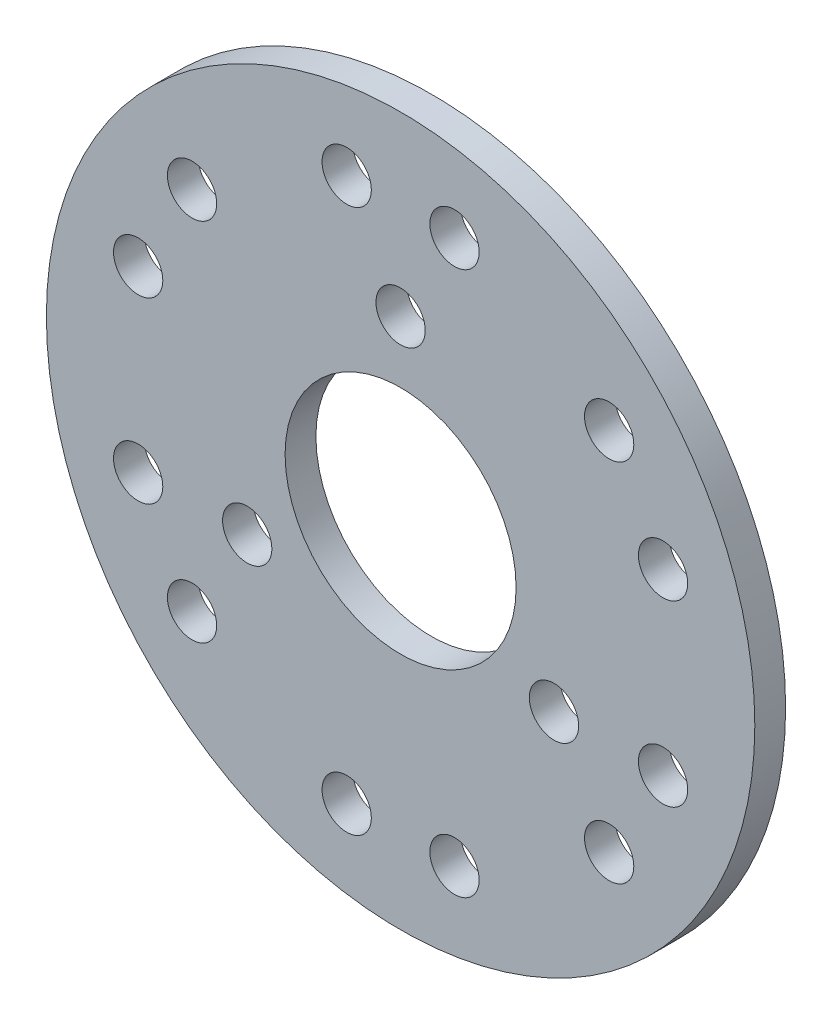
ISO-10303-21;
HEADER;
FILE_DESCRIPTION(('STEP AP214'),'2;1');
FILE_NAME('part.step','',(''),(''),'','','');
FILE_SCHEMA(('AUTOMOTIVE_DESIGN { 1 0 10303 214 1 1 1 1 }'));
ENDSEC;
DATA;
#1=APPLICATION_CONTEXT('core data for automotive mechanical design processes');
#2=APPLICATION_PROTOCOL_DEFINITION('international standard','automotive_design',2000,#1);
#3=PRODUCT_CONTEXT('',#1,'mechanical');
#4=PRODUCT('Part','Part','',(#3));
#5=PRODUCT_RELATED_PRODUCT_CATEGORY('part','',(#4));
#6=PRODUCT_DEFINITION_FORMATION('','',#4);
#7=PRODUCT_DEFINITION_CONTEXT('part definition',#1,'design');
#8=PRODUCT_DEFINITION('design','',#6,#7);
#9=PRODUCT_DEFINITION_SHAPE('','',#8);
#10=(LENGTH_UNIT() NAMED_UNIT(*) SI_UNIT(.MILLI.,.METRE.));
#11=(NAMED_UNIT(*) PLANE_ANGLE_UNIT() SI_UNIT($,.RADIAN.));
#12=(NAMED_UNIT(*) SI_UNIT($,.STERADIAN.) SOLID_ANGLE_UNIT());
#13=UNCERTAINTY_MEASURE_WITH_UNIT(LENGTH_MEASURE(1.E-05),#10,'distance_accuracy_value','');
#14=(GEOMETRIC_REPRESENTATION_CONTEXT(3) GLOBAL_UNCERTAINTY_ASSIGNED_CONTEXT((#13)) GLOBAL_UNIT_ASSIGNED_CONTEXT((#10,
#11,#12)) REPRESENTATION_CONTEXT('',''));
#15=CARTESIAN_POINT('',(0.,0.,0.));
#16=DIRECTION('',(0.,0.,1.));
#17=DIRECTION('',(1.,0.,0.));
#18=AXIS2_PLACEMENT_3D('',#15,#16,#17);
#19=CARTESIAN_POINT('',(0.,0.,2.));
#20=DIRECTION('',(0.,0.,-1.));
#21=DIRECTION('',(-1.,0.,0.));
#22=AXIS2_PLACEMENT_3D('',#19,#20,#21);
#23=CYLINDRICAL_SURFACE('',#22,23.);
#24=CARTESIAN_POINT('',(0.,0.,2.));
#25=DIRECTION('',(0.,0.,1.));
#26=DIRECTION('',(1.,0.,0.));
#27=AXIS2_PLACEMENT_3D('',#24,#25,#26);
#28=CIRCLE('',#27,23.);
#29=CARTESIAN_POINT('',(23.,0.,2.));
#30=VERTEX_POINT('',#29);
#31=EDGE_CURVE('E10',#30,#30,#28,.T.);
#32=ORIENTED_EDGE('',*,*,#31,.F.);
#33=EDGE_LOOP('',(#32));
#34=FACE_BOUND('',#33,.T.);
#35=CARTESIAN_POINT('',(0.,0.,0.));
#36=DIRECTION('',(0.,0.,1.));
#37=DIRECTION('',(1.,0.,0.));
#38=AXIS2_PLACEMENT_3D('',#35,#36,#37);
#39=CIRCLE('',#38,23.);
#40=CARTESIAN_POINT('',(23.,0.,0.));
#41=VERTEX_POINT('',#40);
#42=EDGE_CURVE('E34',#41,#41,#39,.T.);
#43=ORIENTED_EDGE('',*,*,#42,.T.);
#44=EDGE_LOOP('',(#43));
#45=FACE_BOUND('',#44,.T.);
#46=ADVANCED_FACE('F31',(#34,#45),#23,.T.);
#47=CARTESIAN_POINT('',(0.,0.,2.));
#48=DIRECTION('',(0.,0.,1.));
#49=DIRECTION('',(1.,0.,0.));
#50=AXIS2_PLACEMENT_3D('',#47,#48,#49);
#51=PLANE('',#50);
#52=CARTESIAN_POINT('',(-3.50000000000012,-17.6564435830096,2.));
#53=DIRECTION('',(0.,0.,1.));
#54=DIRECTION('',(1.,0.,0.));
#55=AXIS2_PLACEMENT_3D('',#52,#53,#54);
#56=CIRCLE('',#55,1.6);
#57=CARTESIAN_POINT('',(-1.90000000000012,-17.6564435830096,2.));
#58=VERTEX_POINT('',#57);
#59=EDGE_CURVE('E73',#58,#58,#56,.T.);
#60=ORIENTED_EDGE('',*,*,#59,.F.);
#61=EDGE_LOOP('',(#60));
#62=FACE_BOUND('',#61,.T.);
#63=CARTESIAN_POINT('',(3.49999999999988,-17.6564435830096,2.));
#64=DIRECTION('',(0.,0.,1.));
#65=DIRECTION('',(1.,0.,0.));
#66=AXIS2_PLACEMENT_3D('',#63,#64,#65);
#67=CIRCLE('',#66,1.6);
#68=CARTESIAN_POINT('',(5.09999999999988,-17.6564435830096,2.));
#69=VERTEX_POINT('',#68);
#70=EDGE_CURVE('E80',#69,#69,#67,.T.);
#71=ORIENTED_EDGE('',*,*,#70,.F.);
#72=EDGE_LOOP('',(#71));
#73=FACE_BOUND('',#72,.T.);
#74=CARTESIAN_POINT('',(13.540928683373,-11.8593107047504,2.));
#75=DIRECTION('',(0.,0.,1.));
#76=DIRECTION('',(1.,0.,0.));
#77=AXIS2_PLACEMENT_3D('',#74,#75,#76);
#78=CIRCLE('',#77,1.6);
#79=CARTESIAN_POINT('',(15.140928683373,-11.8593107047504,2.));
#80=VERTEX_POINT('',#79);
#81=EDGE_CURVE('E86',#80,#80,#78,.T.);
#82=ORIENTED_EDGE('',*,*,#81,.F.);
#83=EDGE_LOOP('',(#82));
#84=FACE_BOUND('',#83,.T.);
#85=CARTESIAN_POINT('',(17.040928683373,-5.79713287825933,2.));
#86=DIRECTION('',(0.,0.,1.));
#87=DIRECTION('',(1.,0.,0.));
#88=AXIS2_PLACEMENT_3D('',#85,#86,#87);
#89=CIRCLE('',#88,1.6);
#90=CARTESIAN_POINT('',(18.640928683373,-5.79713287825933,2.));
#91=VERTEX_POINT('',#90);
#92=EDGE_CURVE('E92',#91,#91,#89,.T.);
#93=ORIENTED_EDGE('',*,*,#92,.F.);
#94=EDGE_LOOP('',(#93));
#95=FACE_BOUND('',#94,.T.);
#96=CARTESIAN_POINT('',(17.040928683373,5.79713287825921,2.));
#97=DIRECTION('',(0.,0.,1.));
#98=DIRECTION('',(1.,0.,0.));
#99=AXIS2_PLACEMENT_3D('',#96,#97,#98);
#100=CIRCLE('',#99,1.6);
#101=CARTESIAN_POINT('',(18.640928683373,5.79713287825921,2.));
#102=VERTEX_POINT('',#101);
#103=EDGE_CURVE('E49',#102,#102,#100,.T.);
#104=ORIENTED_EDGE('',*,*,#103,.F.);
#105=EDGE_LOOP('',(#104));
#106=FACE_BOUND('',#105,.T.);
#107=CARTESIAN_POINT('',(13.5409286833731,11.8593107047503,2.));
#108=DIRECTION('',(0.,0.,1.));
#109=DIRECTION('',(1.,0.,0.));
#110=AXIS2_PLACEMENT_3D('',#107,#108,#109);
#111=CIRCLE('',#110,1.6);
#112=CARTESIAN_POINT('',(15.1409286833731,11.8593107047503,2.));
#113=VERTEX_POINT('',#112);
#114=EDGE_CURVE('E56',#113,#113,#111,.T.);
#115=ORIENTED_EDGE('',*,*,#114,.F.);
#116=EDGE_LOOP('',(#115));
#117=FACE_BOUND('',#116,.T.);
#118=CARTESIAN_POINT('',(0.,0.,2.));
#119=DIRECTION('',(0.,0.,1.));
#120=DIRECTION('',(1.,0.,0.));
#121=AXIS2_PLACEMENT_3D('',#118,#119,#120);
#122=CIRCLE('',#121,7.5);
#123=CARTESIAN_POINT('',(7.5,0.,2.));
#124=VERTEX_POINT('',#123);
#125=EDGE_CURVE('E62',#124,#124,#122,.T.);
#126=ORIENTED_EDGE('',*,*,#125,.F.);
#127=EDGE_LOOP('',(#126));
#128=FACE_BOUND('',#127,.T.);
#129=CARTESIAN_POINT('',(3.5,17.6564435830096,2.));
#130=DIRECTION('',(0.,0.,1.));
#131=DIRECTION('',(1.,0.,0.));
#132=AXIS2_PLACEMENT_3D('',#129,#130,#131);
#133=CIRCLE('',#132,1.6);
#134=CARTESIAN_POINT('',(5.1,17.6564435830096,2.));
#135=VERTEX_POINT('',#134);
#136=EDGE_CURVE('E68',#135,#135,#133,.T.);
#137=ORIENTED_EDGE('',*,*,#136,.F.);
#138=EDGE_LOOP('',(#137));
#139=FACE_BOUND('',#138,.T.);
#140=CARTESIAN_POINT('',(-13.5409286833731,-11.8593107047502,2.));
#141=DIRECTION('',(0.,0.,1.));
#142=DIRECTION('',(1.,0.,0.));
#143=AXIS2_PLACEMENT_3D('',#140,#141,#142);
#144=CIRCLE('',#143,1.6);
#145=CARTESIAN_POINT('',(-11.9409286833731,-11.8593107047502,2.));
#146=VERTEX_POINT('',#145);
#147=EDGE_CURVE('E133',#146,#146,#144,.T.);
#148=ORIENTED_EDGE('',*,*,#147,.F.);
#149=EDGE_LOOP('',(#148));
#150=FACE_BOUND('',#149,.T.);
#151=CARTESIAN_POINT('',(-17.0409286833731,-5.79713287825909,2.));
#152=DIRECTION('',(0.,0.,1.));
#153=DIRECTION('',(1.,0.,0.));
#154=AXIS2_PLACEMENT_3D('',#151,#152,#153);
#155=CIRCLE('',#154,1.6);
#156=CARTESIAN_POINT('',(-15.4409286833731,-5.79713287825909,2.));
#157=VERTEX_POINT('',#156);
#158=EDGE_CURVE('E127',#157,#157,#155,.T.);
#159=ORIENTED_EDGE('',*,*,#158,.F.);
#160=EDGE_LOOP('',(#159));
#161=FACE_BOUND('',#160,.T.);
#162=CARTESIAN_POINT('',(-17.040928683373,5.79713287825945,2.));
#163=DIRECTION('',(0.,0.,1.));
#164=DIRECTION('',(1.,0.,0.));
#165=AXIS2_PLACEMENT_3D('',#162,#163,#164);
#166=CIRCLE('',#165,1.6);
#167=CARTESIAN_POINT('',(-15.440928683373,5.79713287825945,2.));
#168=VERTEX_POINT('',#167);
#169=EDGE_CURVE('E121',#168,#168,#166,.T.);
#170=ORIENTED_EDGE('',*,*,#169,.F.);
#171=EDGE_LOOP('',(#170));
#172=FACE_BOUND('',#171,.T.);
#173=CARTESIAN_POINT('',(-13.5409286833729,11.8593107047505,2.));
#174=DIRECTION('',(0.,0.,1.));
#175=DIRECTION('',(1.,0.,0.));
#176=AXIS2_PLACEMENT_3D('',#173,#174,#175);
#177=CIRCLE('',#176,1.6);
#178=CARTESIAN_POINT('',(-11.9409286833729,11.8593107047505,2.));
#179=VERTEX_POINT('',#178);
#180=EDGE_CURVE('E115',#179,#179,#177,.T.);
#181=ORIENTED_EDGE('',*,*,#180,.F.);
#182=EDGE_LOOP('',(#181));
#183=FACE_BOUND('',#182,.T.);
#184=CARTESIAN_POINT('',(0.,11.5,2.));
#185=DIRECTION('',(0.,0.,1.));
#186=DIRECTION('',(1.,0.,0.));
#187=AXIS2_PLACEMENT_3D('',#184,#185,#186);
#188=CIRCLE('',#187,1.6);
#189=CARTESIAN_POINT('',(1.6,11.5,2.));
#190=VERTEX_POINT('',#189);
#191=EDGE_CURVE('E109',#190,#190,#188,.T.);
#192=ORIENTED_EDGE('',*,*,#191,.F.);
#193=EDGE_LOOP('',(#192));
#194=FACE_BOUND('',#193,.T.);
#195=CARTESIAN_POINT('',(-9.9592921435211,-5.74999999999991,2.));
#196=DIRECTION('',(0.,0.,1.));
#197=DIRECTION('',(1.,0.,0.));
#198=AXIS2_PLACEMENT_3D('',#195,#196,#197);
#199=CIRCLE('',#198,1.6);
#200=CARTESIAN_POINT('',(-8.3592921435211,-5.74999999999991,2.));
#201=VERTEX_POINT('',#200);
#202=EDGE_CURVE('E103',#201,#201,#199,.T.);
#203=ORIENTED_EDGE('',*,*,#202,.F.);
#204=EDGE_LOOP('',(#203));
#205=FACE_BOUND('',#204,.T.);
#206=CARTESIAN_POINT('',(9.95929214352104,-5.75,2.));
#207=DIRECTION('',(0.,0.,1.));
#208=DIRECTION('',(1.,0.,0.));
#209=AXIS2_PLACEMENT_3D('',#206,#207,#208);
#210=CIRCLE('',#209,1.6);
#211=CARTESIAN_POINT('',(11.559292143521,-5.75,2.));
#212=VERTEX_POINT('',#211);
#213=EDGE_CURVE('E97',#212,#212,#210,.T.);
#214=ORIENTED_EDGE('',*,*,#213,.F.);
#215=EDGE_LOOP('',(#214));
#216=FACE_BOUND('',#215,.T.);
#217=CARTESIAN_POINT('',(-3.5,17.6564435830096,2.));
#218=DIRECTION('',(0.,0.,1.));
#219=DIRECTION('',(1.,0.,0.));
#220=AXIS2_PLACEMENT_3D('',#217,#218,#219);
#221=CIRCLE('',#220,1.6);
#222=CARTESIAN_POINT('',(-1.9,17.6564435830096,2.));
#223=VERTEX_POINT('',#222);
#224=EDGE_CURVE('E43',#223,#223,#221,.T.);
#225=ORIENTED_EDGE('',*,*,#224,.F.);
#226=EDGE_LOOP('',(#225));
#227=FACE_BOUND('',#226,.T.);
#228=ORIENTED_EDGE('',*,*,#31,.T.);
#229=EDGE_LOOP('',(#228));
#230=FACE_BOUND('',#229,.T.);
#231=ADVANCED_FACE('F150',(#62,#73,#84,#95,#106,#117,#128,#139,#150,#161,#172,#183,#194,#205,
#216,#227,#230),#51,.T.);
#232=CARTESIAN_POINT('',(0.,0.,0.));
#233=DIRECTION('',(0.,0.,1.));
#234=DIRECTION('',(1.,0.,0.));
#235=AXIS2_PLACEMENT_3D('',#232,#233,#234);
#236=PLANE('',#235);
#237=CARTESIAN_POINT('',(-3.50000000000012,-17.6564435830096,0.));
#238=DIRECTION('',(0.,0.,1.));
#239=DIRECTION('',(1.,0.,0.));
#240=AXIS2_PLACEMENT_3D('',#237,#238,#239);
#241=CIRCLE('',#240,1.6);
#242=CARTESIAN_POINT('',(-1.90000000000012,-17.6564435830096,0.));
#243=VERTEX_POINT('',#242);
#244=EDGE_CURVE('E76',#243,#243,#241,.T.);
#245=ORIENTED_EDGE('',*,*,#244,.T.);
#246=EDGE_LOOP('',(#245));
#247=FACE_BOUND('',#246,.T.);
#248=CARTESIAN_POINT('',(3.49999999999988,-17.6564435830096,0.));
#249=DIRECTION('',(0.,0.,1.));
#250=DIRECTION('',(1.,0.,0.));
#251=AXIS2_PLACEMENT_3D('',#248,#249,#250);
#252=CIRCLE('',#251,1.6);
#253=CARTESIAN_POINT('',(5.09999999999988,-17.6564435830096,0.));
#254=VERTEX_POINT('',#253);
#255=EDGE_CURVE('E83',#254,#254,#252,.T.);
#256=ORIENTED_EDGE('',*,*,#255,.T.);
#257=EDGE_LOOP('',(#256));
#258=FACE_BOUND('',#257,.T.);
#259=CARTESIAN_POINT('',(13.540928683373,-11.8593107047504,0.));
#260=DIRECTION('',(0.,0.,1.));
#261=DIRECTION('',(1.,0.,0.));
#262=AXIS2_PLACEMENT_3D('',#259,#260,#261);
#263=CIRCLE('',#262,1.6);
#264=CARTESIAN_POINT('',(15.140928683373,-11.8593107047504,0.));
#265=VERTEX_POINT('',#264);
#266=EDGE_CURVE('E89',#265,#265,#263,.T.);
#267=ORIENTED_EDGE('',*,*,#266,.T.);
#268=EDGE_LOOP('',(#267));
#269=FACE_BOUND('',#268,.T.);
#270=CARTESIAN_POINT('',(17.040928683373,-5.79713287825933,0.));
#271=DIRECTION('',(0.,0.,1.));
#272=DIRECTION('',(1.,0.,0.));
#273=AXIS2_PLACEMENT_3D('',#270,#271,#272);
#274=CIRCLE('',#273,1.6);
#275=CARTESIAN_POINT('',(18.640928683373,-5.79713287825933,0.));
#276=VERTEX_POINT('',#275);
#277=EDGE_CURVE('E53',#276,#276,#274,.T.);
#278=ORIENTED_EDGE('',*,*,#277,.T.);
#279=EDGE_LOOP('',(#278));
#280=FACE_BOUND('',#279,.T.);
#281=CARTESIAN_POINT('',(17.040928683373,5.79713287825921,0.));
#282=DIRECTION('',(0.,0.,1.));
#283=DIRECTION('',(1.,0.,0.));
#284=AXIS2_PLACEMENT_3D('',#281,#282,#283);
#285=CIRCLE('',#284,1.6);
#286=CARTESIAN_POINT('',(18.640928683373,5.79713287825921,0.));
#287=VERTEX_POINT('',#286);
#288=EDGE_CURVE('E52',#287,#287,#285,.T.);
#289=ORIENTED_EDGE('',*,*,#288,.T.);
#290=EDGE_LOOP('',(#289));
#291=FACE_BOUND('',#290,.T.);
#292=CARTESIAN_POINT('',(13.5409286833731,11.8593107047503,0.));
#293=DIRECTION('',(0.,0.,1.));
#294=DIRECTION('',(1.,0.,0.));
#295=AXIS2_PLACEMENT_3D('',#292,#293,#294);
#296=CIRCLE('',#295,1.6);
#297=CARTESIAN_POINT('',(15.1409286833731,11.8593107047503,0.));
#298=VERTEX_POINT('',#297);
#299=EDGE_CURVE('E59',#298,#298,#296,.T.);
#300=ORIENTED_EDGE('',*,*,#299,.T.);
#301=EDGE_LOOP('',(#300));
#302=FACE_BOUND('',#301,.T.);
#303=CARTESIAN_POINT('',(0.,0.,0.));
#304=DIRECTION('',(0.,0.,1.));
#305=DIRECTION('',(1.,0.,0.));
#306=AXIS2_PLACEMENT_3D('',#303,#304,#305);
#307=CIRCLE('',#306,7.5);
#308=CARTESIAN_POINT('',(7.5,0.,0.));
#309=VERTEX_POINT('',#308);
#310=EDGE_CURVE('E65',#309,#309,#307,.T.);
#311=ORIENTED_EDGE('',*,*,#310,.T.);
#312=EDGE_LOOP('',(#311));
#313=FACE_BOUND('',#312,.T.);
#314=CARTESIAN_POINT('',(3.5,17.6564435830096,0.));
#315=DIRECTION('',(0.,0.,1.));
#316=DIRECTION('',(1.,0.,0.));
#317=AXIS2_PLACEMENT_3D('',#314,#315,#316);
#318=CIRCLE('',#317,1.6);
#319=CARTESIAN_POINT('',(5.1,17.6564435830096,0.));
#320=VERTEX_POINT('',#319);
#321=EDGE_CURVE('E46',#320,#320,#318,.T.);
#322=ORIENTED_EDGE('',*,*,#321,.T.);
#323=EDGE_LOOP('',(#322));
#324=FACE_BOUND('',#323,.T.);
#325=CARTESIAN_POINT('',(-13.5409286833731,-11.8593107047502,0.));
#326=DIRECTION('',(0.,0.,1.));
#327=DIRECTION('',(1.,0.,0.));
#328=AXIS2_PLACEMENT_3D('',#325,#326,#327);
#329=CIRCLE('',#328,1.6);
#330=CARTESIAN_POINT('',(-11.9409286833731,-11.8593107047502,0.));
#331=VERTEX_POINT('',#330);
#332=EDGE_CURVE('E77',#331,#331,#329,.T.);
#333=ORIENTED_EDGE('',*,*,#332,.T.);
#334=EDGE_LOOP('',(#333));
#335=FACE_BOUND('',#334,.T.);
#336=CARTESIAN_POINT('',(-17.0409286833731,-5.79713287825909,0.));
#337=DIRECTION('',(0.,0.,1.));
#338=DIRECTION('',(1.,0.,0.));
#339=AXIS2_PLACEMENT_3D('',#336,#337,#338);
#340=CIRCLE('',#339,1.6);
#341=CARTESIAN_POINT('',(-15.4409286833731,-5.79713287825909,0.));
#342=VERTEX_POINT('',#341);
#343=EDGE_CURVE('E130',#342,#342,#340,.T.);
#344=ORIENTED_EDGE('',*,*,#343,.T.);
#345=EDGE_LOOP('',(#344));
#346=FACE_BOUND('',#345,.T.);
#347=CARTESIAN_POINT('',(-17.040928683373,5.79713287825945,0.));
#348=DIRECTION('',(0.,0.,1.));
#349=DIRECTION('',(1.,0.,0.));
#350=AXIS2_PLACEMENT_3D('',#347,#348,#349);
#351=CIRCLE('',#350,1.6);
#352=CARTESIAN_POINT('',(-15.440928683373,5.79713287825945,0.));
#353=VERTEX_POINT('',#352);
#354=EDGE_CURVE('E124',#353,#353,#351,.T.);
#355=ORIENTED_EDGE('',*,*,#354,.T.);
#356=EDGE_LOOP('',(#355));
#357=FACE_BOUND('',#356,.T.);
#358=CARTESIAN_POINT('',(-13.5409286833729,11.8593107047505,0.));
#359=DIRECTION('',(0.,0.,1.));
#360=DIRECTION('',(1.,0.,0.));
#361=AXIS2_PLACEMENT_3D('',#358,#359,#360);
#362=CIRCLE('',#361,1.6);
#363=CARTESIAN_POINT('',(-11.9409286833729,11.8593107047505,0.));
#364=VERTEX_POINT('',#363);
#365=EDGE_CURVE('E118',#364,#364,#362,.T.);
#366=ORIENTED_EDGE('',*,*,#365,.T.);
#367=EDGE_LOOP('',(#366));
#368=FACE_BOUND('',#367,.T.);
#369=CARTESIAN_POINT('',(0.,11.5,0.));
#370=DIRECTION('',(0.,0.,1.));
#371=DIRECTION('',(1.,0.,0.));
#372=AXIS2_PLACEMENT_3D('',#369,#370,#371);
#373=CIRCLE('',#372,1.6);
#374=CARTESIAN_POINT('',(1.6,11.5,0.));
#375=VERTEX_POINT('',#374);
#376=EDGE_CURVE('E112',#375,#375,#373,.T.);
#377=ORIENTED_EDGE('',*,*,#376,.T.);
#378=EDGE_LOOP('',(#377));
#379=FACE_BOUND('',#378,.T.);
#380=CARTESIAN_POINT('',(-9.9592921435211,-5.74999999999991,0.));
#381=DIRECTION('',(0.,0.,1.));
#382=DIRECTION('',(1.,0.,0.));
#383=AXIS2_PLACEMENT_3D('',#380,#381,#382);
#384=CIRCLE('',#383,1.6);
#385=CARTESIAN_POINT('',(-8.3592921435211,-5.74999999999991,0.));
#386=VERTEX_POINT('',#385);
#387=EDGE_CURVE('E106',#386,#386,#384,.T.);
#388=ORIENTED_EDGE('',*,*,#387,.T.);
#389=EDGE_LOOP('',(#388));
#390=FACE_BOUND('',#389,.T.);
#391=CARTESIAN_POINT('',(9.95929214352104,-5.75,0.));
#392=DIRECTION('',(0.,0.,1.));
#393=DIRECTION('',(1.,0.,0.));
#394=AXIS2_PLACEMENT_3D('',#391,#392,#393);
#395=CIRCLE('',#394,1.6);
#396=CARTESIAN_POINT('',(11.559292143521,-5.75,0.));
#397=VERTEX_POINT('',#396);
#398=EDGE_CURVE('E100',#397,#397,#395,.T.);
#399=ORIENTED_EDGE('',*,*,#398,.T.);
#400=EDGE_LOOP('',(#399));
#401=FACE_BOUND('',#400,.T.);
#402=CARTESIAN_POINT('',(-3.5,17.6564435830096,0.));
#403=DIRECTION('',(0.,0.,1.));
#404=DIRECTION('',(1.,0.,0.));
#405=AXIS2_PLACEMENT_3D('',#402,#403,#404);
#406=CIRCLE('',#405,1.6);
#407=CARTESIAN_POINT('',(-1.9,17.6564435830096,0.));
#408=VERTEX_POINT('',#407);
#409=EDGE_CURVE('E41',#408,#408,#406,.T.);
#410=ORIENTED_EDGE('',*,*,#409,.T.);
#411=EDGE_LOOP('',(#410));
#412=FACE_BOUND('',#411,.T.);
#413=ORIENTED_EDGE('',*,*,#42,.F.);
#414=EDGE_LOOP('',(#413));
#415=FACE_BOUND('',#414,.T.);
#416=ADVANCED_FACE('F139',(#247,#258,#269,#280,#291,#302,#313,#324,#335,#346,#357,#368,#379,
#390,#401,#412,#415),#236,.F.);
#417=CARTESIAN_POINT('',(-3.5,17.6564435830096,0.));
#418=DIRECTION('',(0.,0.,1.));
#419=DIRECTION('',(1.,0.,0.));
#420=AXIS2_PLACEMENT_3D('',#417,#418,#419);
#421=CYLINDRICAL_SURFACE('',#420,1.6);
#422=ORIENTED_EDGE('',*,*,#409,.F.);
#423=EDGE_LOOP('',(#422));
#424=FACE_BOUND('',#423,.T.);
#425=ORIENTED_EDGE('',*,*,#224,.T.);
#426=EDGE_LOOP('',(#425));
#427=FACE_BOUND('',#426,.T.);
#428=ADVANCED_FACE('F169',(#424,#427),#421,.F.);
#429=CARTESIAN_POINT('',(9.95929214352104,-5.75,0.));
#430=DIRECTION('',(0.,0.,1.));
#431=DIRECTION('',(1.,0.,0.));
#432=AXIS2_PLACEMENT_3D('',#429,#430,#431);
#433=CYLINDRICAL_SURFACE('',#432,1.6);
#434=ORIENTED_EDGE('',*,*,#398,.F.);
#435=EDGE_LOOP('',(#434));
#436=FACE_BOUND('',#435,.T.);
#437=ORIENTED_EDGE('',*,*,#213,.T.);
#438=EDGE_LOOP('',(#437));
#439=FACE_BOUND('',#438,.T.);
#440=ADVANCED_FACE('F171',(#436,#439),#433,.F.);
#441=CARTESIAN_POINT('',(-9.9592921435211,-5.74999999999991,0.));
#442=DIRECTION('',(0.,0.,1.));
#443=DIRECTION('',(1.,0.,0.));
#444=AXIS2_PLACEMENT_3D('',#441,#442,#443);
#445=CYLINDRICAL_SURFACE('',#444,1.6);
#446=ORIENTED_EDGE('',*,*,#387,.F.);
#447=EDGE_LOOP('',(#446));
#448=FACE_BOUND('',#447,.T.);
#449=ORIENTED_EDGE('',*,*,#202,.T.);
#450=EDGE_LOOP('',(#449));
#451=FACE_BOUND('',#450,.T.);
#452=ADVANCED_FACE('F178',(#448,#451),#445,.F.);
#453=CARTESIAN_POINT('',(0.,11.5,0.));
#454=DIRECTION('',(0.,0.,1.));
#455=DIRECTION('',(1.,0.,0.));
#456=AXIS2_PLACEMENT_3D('',#453,#454,#455);
#457=CYLINDRICAL_SURFACE('',#456,1.6);
#458=ORIENTED_EDGE('',*,*,#376,.F.);
#459=EDGE_LOOP('',(#458));
#460=FACE_BOUND('',#459,.T.);
#461=ORIENTED_EDGE('',*,*,#191,.T.);
#462=EDGE_LOOP('',(#461));
#463=FACE_BOUND('',#462,.T.);
#464=ADVANCED_FACE('F218',(#460,#463),#457,.F.);
#465=CARTESIAN_POINT('',(-13.5409286833729,11.8593107047505,0.));
#466=DIRECTION('',(0.,0.,1.));
#467=DIRECTION('',(1.,0.,0.));
#468=AXIS2_PLACEMENT_3D('',#465,#466,#467);
#469=CYLINDRICAL_SURFACE('',#468,1.6);
#470=ORIENTED_EDGE('',*,*,#365,.F.);
#471=EDGE_LOOP('',(#470));
#472=FACE_BOUND('',#471,.T.);
#473=ORIENTED_EDGE('',*,*,#180,.T.);
#474=EDGE_LOOP('',(#473));
#475=FACE_BOUND('',#474,.T.);
#476=ADVANCED_FACE('F228',(#472,#475),#469,.F.);
#477=CARTESIAN_POINT('',(-17.040928683373,5.79713287825945,0.));
#478=DIRECTION('',(0.,0.,1.));
#479=DIRECTION('',(1.,0.,0.));
#480=AXIS2_PLACEMENT_3D('',#477,#478,#479);
#481=CYLINDRICAL_SURFACE('',#480,1.6);
#482=ORIENTED_EDGE('',*,*,#354,.F.);
#483=EDGE_LOOP('',(#482));
#484=FACE_BOUND('',#483,.T.);
#485=ORIENTED_EDGE('',*,*,#169,.T.);
#486=EDGE_LOOP('',(#485));
#487=FACE_BOUND('',#486,.T.);
#488=ADVANCED_FACE('F238',(#484,#487),#481,.F.);
#489=CARTESIAN_POINT('',(-17.0409286833731,-5.79713287825909,0.));
#490=DIRECTION('',(0.,0.,1.));
#491=DIRECTION('',(1.,0.,0.));
#492=AXIS2_PLACEMENT_3D('',#489,#490,#491);
#493=CYLINDRICAL_SURFACE('',#492,1.6);
#494=ORIENTED_EDGE('',*,*,#343,.F.);
#495=EDGE_LOOP('',(#494));
#496=FACE_BOUND('',#495,.T.);
#497=ORIENTED_EDGE('',*,*,#158,.T.);
#498=EDGE_LOOP('',(#497));
#499=FACE_BOUND('',#498,.T.);
#500=ADVANCED_FACE('F146',(#496,#499),#493,.F.);
#501=CARTESIAN_POINT('',(-13.5409286833731,-11.8593107047502,0.));
#502=DIRECTION('',(0.,0.,1.));
#503=DIRECTION('',(1.,0.,0.));
#504=AXIS2_PLACEMENT_3D('',#501,#502,#503);
#505=CYLINDRICAL_SURFACE('',#504,1.6);
#506=ORIENTED_EDGE('',*,*,#332,.F.);
#507=EDGE_LOOP('',(#506));
#508=FACE_BOUND('',#507,.T.);
#509=ORIENTED_EDGE('',*,*,#147,.T.);
#510=EDGE_LOOP('',(#509));
#511=FACE_BOUND('',#510,.T.);
#512=ADVANCED_FACE('F142',(#508,#511),#505,.F.);
#513=CARTESIAN_POINT('',(3.5,17.6564435830096,0.));
#514=DIRECTION('',(0.,0.,1.));
#515=DIRECTION('',(1.,0.,0.));
#516=AXIS2_PLACEMENT_3D('',#513,#514,#515);
#517=CYLINDRICAL_SURFACE('',#516,1.6);
#518=ORIENTED_EDGE('',*,*,#321,.F.);
#519=EDGE_LOOP('',(#518));
#520=FACE_BOUND('',#519,.T.);
#521=ORIENTED_EDGE('',*,*,#136,.T.);
#522=EDGE_LOOP('',(#521));
#523=FACE_BOUND('',#522,.T.);
#524=ADVANCED_FACE('F145',(#520,#523),#517,.F.);
#525=CARTESIAN_POINT('',(0.,0.,0.));
#526=DIRECTION('',(0.,0.,1.));
#527=DIRECTION('',(1.,0.,0.));
#528=AXIS2_PLACEMENT_3D('',#525,#526,#527);
#529=CYLINDRICAL_SURFACE('',#528,7.5);
#530=ORIENTED_EDGE('',*,*,#310,.F.);
#531=EDGE_LOOP('',(#530));
#532=FACE_BOUND('',#531,.T.);
#533=ORIENTED_EDGE('',*,*,#125,.T.);
#534=EDGE_LOOP('',(#533));
#535=FACE_BOUND('',#534,.T.);
#536=ADVANCED_FACE('F272',(#532,#535),#529,.F.);
#537=CARTESIAN_POINT('',(13.5409286833731,11.8593107047503,0.));
#538=DIRECTION('',(0.,0.,1.));
#539=DIRECTION('',(1.,0.,0.));
#540=AXIS2_PLACEMENT_3D('',#537,#538,#539);
#541=CYLINDRICAL_SURFACE('',#540,1.6);
#542=ORIENTED_EDGE('',*,*,#299,.F.);
#543=EDGE_LOOP('',(#542));
#544=FACE_BOUND('',#543,.T.);
#545=ORIENTED_EDGE('',*,*,#114,.T.);
#546=EDGE_LOOP('',(#545));
#547=FACE_BOUND('',#546,.T.);
#548=ADVANCED_FACE('F282',(#544,#547),#541,.F.);
#549=CARTESIAN_POINT('',(17.040928683373,5.79713287825921,0.));
#550=DIRECTION('',(0.,0.,1.));
#551=DIRECTION('',(1.,0.,0.));
#552=AXIS2_PLACEMENT_3D('',#549,#550,#551);
#553=CYLINDRICAL_SURFACE('',#552,1.6);
#554=ORIENTED_EDGE('',*,*,#288,.F.);
#555=EDGE_LOOP('',(#554));
#556=FACE_BOUND('',#555,.T.);
#557=ORIENTED_EDGE('',*,*,#103,.T.);
#558=EDGE_LOOP('',(#557));
#559=FACE_BOUND('',#558,.T.);
#560=ADVANCED_FACE('F292',(#556,#559),#553,.F.);
#561=CARTESIAN_POINT('',(17.040928683373,-5.79713287825933,0.));
#562=DIRECTION('',(0.,0.,1.));
#563=DIRECTION('',(1.,0.,0.));
#564=AXIS2_PLACEMENT_3D('',#561,#562,#563);
#565=CYLINDRICAL_SURFACE('',#564,1.6);
#566=ORIENTED_EDGE('',*,*,#277,.F.);
#567=EDGE_LOOP('',(#566));
#568=FACE_BOUND('',#567,.T.);
#569=ORIENTED_EDGE('',*,*,#92,.T.);
#570=EDGE_LOOP('',(#569));
#571=FACE_BOUND('',#570,.T.);
#572=ADVANCED_FACE('F302',(#568,#571),#565,.F.);
#573=CARTESIAN_POINT('',(13.540928683373,-11.8593107047504,0.));
#574=DIRECTION('',(0.,0.,1.));
#575=DIRECTION('',(1.,0.,0.));
#576=AXIS2_PLACEMENT_3D('',#573,#574,#575);
#577=CYLINDRICAL_SURFACE('',#576,1.6);
#578=ORIENTED_EDGE('',*,*,#266,.F.);
#579=EDGE_LOOP('',(#578));
#580=FACE_BOUND('',#579,.T.);
#581=ORIENTED_EDGE('',*,*,#81,.T.);
#582=EDGE_LOOP('',(#581));
#583=FACE_BOUND('',#582,.T.);
#584=ADVANCED_FACE('F311',(#580,#583),#577,.F.);
#585=CARTESIAN_POINT('',(3.49999999999988,-17.6564435830096,0.));
#586=DIRECTION('',(0.,0.,1.));
#587=DIRECTION('',(1.,0.,0.));
#588=AXIS2_PLACEMENT_3D('',#585,#586,#587);
#589=CYLINDRICAL_SURFACE('',#588,1.6);
#590=ORIENTED_EDGE('',*,*,#255,.F.);
#591=EDGE_LOOP('',(#590));
#592=FACE_BOUND('',#591,.T.);
#593=ORIENTED_EDGE('',*,*,#70,.T.);
#594=EDGE_LOOP('',(#593));
#595=FACE_BOUND('',#594,.T.);
#596=ADVANCED_FACE('F321',(#592,#595),#589,.F.);
#597=CARTESIAN_POINT('',(-3.50000000000012,-17.6564435830096,0.));
#598=DIRECTION('',(0.,0.,1.));
#599=DIRECTION('',(1.,0.,0.));
#600=AXIS2_PLACEMENT_3D('',#597,#598,#599);
#601=CYLINDRICAL_SURFACE('',#600,1.6);
#602=ORIENTED_EDGE('',*,*,#244,.F.);
#603=EDGE_LOOP('',(#602));
#604=FACE_BOUND('',#603,.T.);
#605=ORIENTED_EDGE('',*,*,#59,.T.);
#606=EDGE_LOOP('',(#605));
#607=FACE_BOUND('',#606,.T.);
#608=ADVANCED_FACE('F331',(#604,#607),#601,.F.);
#609=CLOSED_SHELL('',(#46,#231,#416,#428,#440,#452,#464,#476,#488,#500,#512,#524,#536,#548,#560,
#572,#584,#596,#608));
#610=MANIFOLD_SOLID_BREP('B2',#609);
#611=ADVANCED_BREP_SHAPE_REPRESENTATION('',(#18,#610),#14);
#612=SHAPE_DEFINITION_REPRESENTATION(#9,#611);
ENDSEC;
END-ISO-10303-21;
